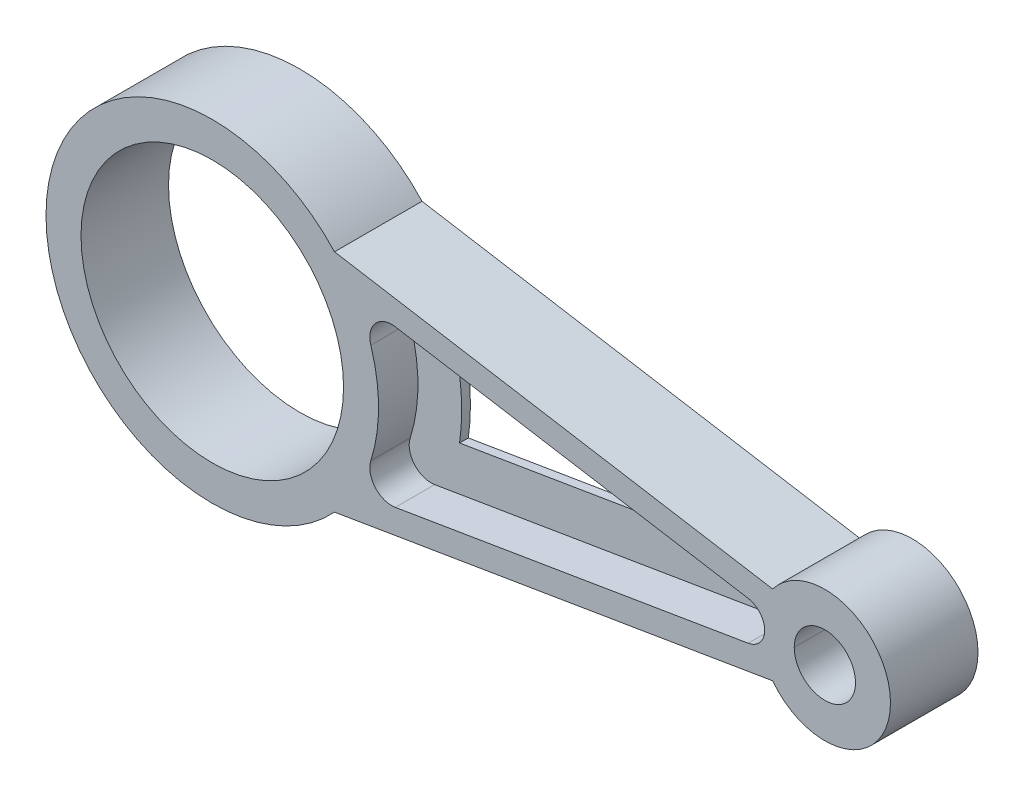
ISO-10303-21;
HEADER;
FILE_DESCRIPTION(('STEP AP214'),'2;1');
FILE_NAME('part.step','',(''),(''),'','','');
FILE_SCHEMA(('AUTOMOTIVE_DESIGN { 1 0 10303 214 1 1 1 1 }'));
ENDSEC;
DATA;
#1=APPLICATION_CONTEXT('core data for automotive mechanical design processes');
#2=APPLICATION_PROTOCOL_DEFINITION('international standard','automotive_design',2000,#1);
#3=PRODUCT_CONTEXT('',#1,'mechanical');
#4=PRODUCT('Part','Part','',(#3));
#5=PRODUCT_RELATED_PRODUCT_CATEGORY('part','',(#4));
#6=PRODUCT_DEFINITION_FORMATION('','',#4);
#7=PRODUCT_DEFINITION_CONTEXT('part definition',#1,'design');
#8=PRODUCT_DEFINITION('design','',#6,#7);
#9=PRODUCT_DEFINITION_SHAPE('','',#8);
#10=(LENGTH_UNIT() NAMED_UNIT(*) SI_UNIT(.MILLI.,.METRE.));
#11=(NAMED_UNIT(*) PLANE_ANGLE_UNIT() SI_UNIT($,.RADIAN.));
#12=(NAMED_UNIT(*) SI_UNIT($,.STERADIAN.) SOLID_ANGLE_UNIT());
#13=UNCERTAINTY_MEASURE_WITH_UNIT(LENGTH_MEASURE(1.E-05),#10,'distance_accuracy_value','');
#14=(GEOMETRIC_REPRESENTATION_CONTEXT(3) GLOBAL_UNCERTAINTY_ASSIGNED_CONTEXT((#13)) GLOBAL_UNIT_ASSIGNED_CONTEXT((#10,
#11,#12)) REPRESENTATION_CONTEXT('',''));
#15=CARTESIAN_POINT('',(0.,0.,0.));
#16=DIRECTION('',(0.,0.,1.));
#17=DIRECTION('',(1.,0.,0.));
#18=AXIS2_PLACEMENT_3D('',#15,#16,#17);
#19=CARTESIAN_POINT('',(41.007125986905,-12.9389187451698,1.));
#20=DIRECTION('',(0.,0.,1.));
#21=DIRECTION('',(1.,0.,0.));
#22=AXIS2_PLACEMENT_3D('',#19,#20,#21);
#23=PLANE('',#22);
#24=CARTESIAN_POINT('',(41.007125986905,-12.9389187451698,1.));
#25=DIRECTION('',(0.,0.,1.));
#26=DIRECTION('',(1.,0.,0.));
#27=AXIS2_PLACEMENT_3D('',#24,#25,#26);
#28=CIRCLE('',#27,5.);
#29=CARTESIAN_POINT('',(36.2388555233114,-11.4343933096849,1.));
#30=VERTEX_POINT('',#29);
#31=CARTESIAN_POINT('',(41.8285545583335,-17.8709827250915,1.));
#32=VERTEX_POINT('',#31);
#33=EDGE_CURVE('E275',#30,#32,#28,.T.);
#34=ORIENTED_EDGE('',*,*,#33,.T.);
#35=DIRECTION('',(0.986412795984335,0.164285714285714,0.));
#36=VECTOR('',#35,1.);
#37=CARTESIAN_POINT('',(122.478416149068,-4.4388575819296,1.));
#38=LINE('',#37,#36);
#39=CARTESIAN_POINT('',(122.478416149068,-4.4388575819296,1.));
#40=VERTEX_POINT('',#39);
#41=EDGE_CURVE('E279',#32,#40,#38,.T.);
#42=ORIENTED_EDGE('',*,*,#41,.T.);
#43=CARTESIAN_POINT('',(121.739130434783,0.,1.));
#44=DIRECTION('',(0.,0.,1.));
#45=DIRECTION('',(-1.,0.,0.));
#46=AXIS2_PLACEMENT_3D('',#43,#44,#45);
#47=CIRCLE('',#46,4.5);
#48=CARTESIAN_POINT('',(122.478416149068,4.4388575819296,1.));
#49=VERTEX_POINT('',#48);
#50=EDGE_CURVE('E284',#40,#49,#47,.T.);
#51=ORIENTED_EDGE('',*,*,#50,.T.);
#52=DIRECTION('',(-0.986412795984335,0.164285714285714,0.));
#53=VECTOR('',#52,1.);
#54=CARTESIAN_POINT('',(41.8285545583335,17.8709827250915,1.));
#55=LINE('',#54,#53);
#56=CARTESIAN_POINT('',(41.8285545583335,17.8709827250915,1.));
#57=VERTEX_POINT('',#56);
#58=EDGE_CURVE('E288',#49,#57,#55,.T.);
#59=ORIENTED_EDGE('',*,*,#58,.T.);
#60=CARTESIAN_POINT('',(41.007125986905,12.9389187451698,1.));
#61=DIRECTION('',(0.,0.,1.));
#62=DIRECTION('',(-1.,0.,0.));
#63=AXIS2_PLACEMENT_3D('',#60,#61,#62);
#64=CIRCLE('',#63,5.);
#65=CARTESIAN_POINT('',(36.2388555233114,11.4343933096849,1.));
#66=VERTEX_POINT('',#65);
#67=EDGE_CURVE('E292',#57,#66,#64,.T.);
#68=ORIENTED_EDGE('',*,*,#67,.T.);
#69=CARTESIAN_POINT('',(0.,0.,1.));
#70=DIRECTION('',(0.,0.,-1.));
#71=DIRECTION('',(1.,0.,0.));
#72=AXIS2_PLACEMENT_3D('',#69,#70,#71);
#73=CIRCLE('',#72,38.);
#74=EDGE_CURVE('E296',#66,#30,#73,.T.);
#75=ORIENTED_EDGE('',*,*,#74,.T.);
#76=EDGE_LOOP('',(#34,#42,#51,#59,#68,#75));
#77=FACE_BOUND('',#76,.T.);
#78=DIRECTION('',(0.986412795984335,0.164285714285714,0.));
#79=VECTOR('',#78,1.);
#80=CARTESIAN_POINT('',(2.38214285714286,-14.3029855417729,1.));
#81=LINE('',#80,#79);
#82=CARTESIAN_POINT('',(47.5179392364682,-6.78567982735087,1.));
#83=VERTEX_POINT('',#82);
#84=CARTESIAN_POINT('',(88.2608695652175,0.,1.));
#85=VERTEX_POINT('',#84);
#86=EDGE_CURVE('E59',#83,#85,#81,.T.);
#87=ORIENTED_EDGE('',*,*,#86,.F.);
#88=CARTESIAN_POINT('',(0.,0.,1.));
#89=DIRECTION('',(0.,0.,1.));
#90=DIRECTION('',(1.,0.,0.));
#91=AXIS2_PLACEMENT_3D('',#88,#89,#90);
#92=CIRCLE('',#91,48.);
#93=CARTESIAN_POINT('',(47.5179392364682,6.78567982735086,1.));
#94=VERTEX_POINT('',#93);
#95=EDGE_CURVE('E193',#83,#94,#92,.T.);
#96=ORIENTED_EDGE('',*,*,#95,.T.);
#97=DIRECTION('',(-0.986412795984335,0.164285714285714,0.));
#98=VECTOR('',#97,1.);
#99=CARTESIAN_POINT('',(2.38214285714286,14.3029855417729,1.));
#100=LINE('',#99,#98);
#101=EDGE_CURVE('E190',#85,#94,#100,.T.);
#102=ORIENTED_EDGE('',*,*,#101,.F.);
#103=EDGE_LOOP('',(#87,#96,#102));
#104=FACE_BOUND('',#103,.T.);
#105=ADVANCED_FACE('F43',(#77,#104),#23,.T.);
#106=CARTESIAN_POINT('',(41.007125986905,-12.9389187451698,-1.));
#107=DIRECTION('',(0.,0.,-1.));
#108=DIRECTION('',(1.,0.,0.));
#109=AXIS2_PLACEMENT_3D('',#106,#107,#108);
#110=PLANE('',#109);
#111=CARTESIAN_POINT('',(41.007125986905,-12.9389187451698,-1.));
#112=DIRECTION('',(0.,0.,1.));
#113=DIRECTION('',(1.,0.,0.));
#114=AXIS2_PLACEMENT_3D('',#111,#112,#113);
#115=CIRCLE('',#114,5.);
#116=CARTESIAN_POINT('',(36.2388555233114,-11.4343933096849,-1.));
#117=VERTEX_POINT('',#116);
#118=CARTESIAN_POINT('',(41.8285545583335,-17.8709827250915,-1.));
#119=VERTEX_POINT('',#118);
#120=EDGE_CURVE('E212',#117,#119,#115,.T.);
#121=ORIENTED_EDGE('',*,*,#120,.F.);
#122=CARTESIAN_POINT('',(0.,0.,-1.));
#123=DIRECTION('',(0.,0.,-1.));
#124=DIRECTION('',(1.,0.,0.));
#125=AXIS2_PLACEMENT_3D('',#122,#123,#124);
#126=CIRCLE('',#125,38.);
#127=CARTESIAN_POINT('',(36.2388555233114,11.4343933096849,-1.));
#128=VERTEX_POINT('',#127);
#129=EDGE_CURVE('E216',#128,#117,#126,.T.);
#130=ORIENTED_EDGE('',*,*,#129,.F.);
#131=CARTESIAN_POINT('',(41.007125986905,12.9389187451698,-1.));
#132=DIRECTION('',(0.,0.,1.));
#133=DIRECTION('',(-1.,0.,0.));
#134=AXIS2_PLACEMENT_3D('',#131,#132,#133);
#135=CIRCLE('',#134,5.);
#136=CARTESIAN_POINT('',(41.8285545583335,17.8709827250915,-1.));
#137=VERTEX_POINT('',#136);
#138=EDGE_CURVE('E220',#137,#128,#135,.T.);
#139=ORIENTED_EDGE('',*,*,#138,.F.);
#140=DIRECTION('',(-0.986412795984335,0.164285714285714,0.));
#141=VECTOR('',#140,1.);
#142=CARTESIAN_POINT('',(41.8285545583335,17.8709827250915,-1.));
#143=LINE('',#142,#141);
#144=CARTESIAN_POINT('',(122.478416149068,4.4388575819296,-1.));
#145=VERTEX_POINT('',#144);
#146=EDGE_CURVE('E223',#145,#137,#143,.T.);
#147=ORIENTED_EDGE('',*,*,#146,.F.);
#148=CARTESIAN_POINT('',(121.739130434783,0.,-1.));
#149=DIRECTION('',(0.,0.,1.));
#150=DIRECTION('',(-1.,0.,0.));
#151=AXIS2_PLACEMENT_3D('',#148,#149,#150);
#152=CIRCLE('',#151,4.5);
#153=CARTESIAN_POINT('',(122.478416149068,-4.4388575819296,-1.));
#154=VERTEX_POINT('',#153);
#155=EDGE_CURVE('E226',#154,#145,#152,.T.);
#156=ORIENTED_EDGE('',*,*,#155,.F.);
#157=DIRECTION('',(0.986412795984335,0.164285714285714,0.));
#158=VECTOR('',#157,1.);
#159=CARTESIAN_POINT('',(122.478416149068,-4.4388575819296,-1.));
#160=LINE('',#159,#158);
#161=EDGE_CURVE('E229',#119,#154,#160,.T.);
#162=ORIENTED_EDGE('',*,*,#161,.F.);
#163=EDGE_LOOP('',(#121,#130,#139,#147,#156,#162));
#164=FACE_BOUND('',#163,.T.);
#165=DIRECTION('',(0.986412795984335,-0.164285714285714,0.));
#166=VECTOR('',#165,1.);
#167=CARTESIAN_POINT('',(44.3792923494486,7.30841721257518,-1.));
#168=LINE('',#167,#166);
#169=CARTESIAN_POINT('',(47.5179392364682,6.78567982735086,-1.));
#170=VERTEX_POINT('',#169);
#171=CARTESIAN_POINT('',(88.2608695652175,0.,-1.));
#172=VERTEX_POINT('',#171);
#173=EDGE_CURVE('E52',#170,#172,#168,.T.);
#174=ORIENTED_EDGE('',*,*,#173,.F.);
#175=CARTESIAN_POINT('',(0.,0.,-1.));
#176=DIRECTION('',(0.,0.,-1.));
#177=DIRECTION('',(-1.,0.,0.));
#178=AXIS2_PLACEMENT_3D('',#175,#176,#177);
#179=CIRCLE('',#178,48.);
#180=CARTESIAN_POINT('',(47.5179392364682,-6.78567982735087,-1.));
#181=VERTEX_POINT('',#180);
#182=EDGE_CURVE('E11',#170,#181,#179,.T.);
#183=ORIENTED_EDGE('',*,*,#182,.T.);
#184=DIRECTION('',(-0.986412795984335,-0.164285714285714,0.));
#185=VECTOR('',#184,1.);
#186=CARTESIAN_POINT('',(40.1856974154764,-8.00685476524813,-1.));
#187=LINE('',#186,#185);
#188=EDGE_CURVE('E187',#172,#181,#187,.T.);
#189=ORIENTED_EDGE('',*,*,#188,.F.);
#190=EDGE_LOOP('',(#174,#183,#189));
#191=FACE_BOUND('',#190,.T.);
#192=ADVANCED_FACE('F413',(#164,#191),#110,.T.);
#193=CARTESIAN_POINT('',(140.,0.,10.));
#194=DIRECTION('',(0.,0.,-1.));
#195=DIRECTION('',(-1.,0.,0.));
#196=AXIS2_PLACEMENT_3D('',#193,#194,#195);
#197=CYLINDRICAL_SURFACE('',#196,7.00000000000001);
#198=CARTESIAN_POINT('',(140.,0.,10.));
#199=DIRECTION('',(0.,0.,1.));
#200=DIRECTION('',(1.,0.,0.));
#201=AXIS2_PLACEMENT_3D('',#198,#199,#200);
#202=CIRCLE('',#201,7.00000000000001);
#203=CARTESIAN_POINT('',(133.,0.,10.));
#204=VERTEX_POINT('',#203);
#205=CARTESIAN_POINT('',(147.,0.,10.));
#206=VERTEX_POINT('',#205);
#207=EDGE_CURVE('E341',#204,#206,#202,.T.);
#208=ORIENTED_EDGE('',*,*,#207,.T.);
#209=DIRECTION('',(0.,0.,-1.));
#210=VECTOR('',#209,1.);
#211=CARTESIAN_POINT('',(147.,0.,10.));
#212=LINE('',#211,#210);
#213=CARTESIAN_POINT('',(147.,0.,-10.));
#214=VERTEX_POINT('',#213);
#215=EDGE_CURVE('E404',#206,#214,#212,.T.);
#216=ORIENTED_EDGE('',*,*,#215,.T.);
#217=CARTESIAN_POINT('',(140.,0.,-10.));
#218=DIRECTION('',(0.,0.,1.));
#219=DIRECTION('',(1.,0.,0.));
#220=AXIS2_PLACEMENT_3D('',#217,#218,#219);
#221=CIRCLE('',#220,7.00000000000001);
#222=CARTESIAN_POINT('',(133.,0.,-10.));
#223=VERTEX_POINT('',#222);
#224=EDGE_CURVE('E347',#223,#214,#221,.T.);
#225=ORIENTED_EDGE('',*,*,#224,.F.);
#226=DIRECTION('',(0.,0.,1.));
#227=VECTOR('',#226,1.);
#228=CARTESIAN_POINT('',(133.,0.,10.));
#229=LINE('',#228,#227);
#230=EDGE_CURVE('E400',#223,#204,#229,.T.);
#231=ORIENTED_EDGE('',*,*,#230,.T.);
#232=EDGE_LOOP('',(#208,#216,#225,#231));
#233=FACE_BOUND('',#232,.T.);
#234=ADVANCED_FACE('F415',(#233),#197,.F.);
#235=CARTESIAN_POINT('',(0.,0.,-10.));
#236=DIRECTION('',(0.,0.,1.));
#237=DIRECTION('',(1.,0.,0.));
#238=AXIS2_PLACEMENT_3D('',#235,#236,#237);
#239=PLANE('',#238);
#240=ORIENTED_EDGE('',*,*,#224,.T.);
#241=EDGE_CURVE('E325',#214,#223,#221,.T.);
#242=ORIENTED_EDGE('',*,*,#241,.T.);
#243=EDGE_LOOP('',(#240,#242));
#244=FACE_BOUND('',#243,.T.);
#245=CARTESIAN_POINT('',(0.,0.,-10.));
#246=DIRECTION('',(0.,0.,1.));
#247=DIRECTION('',(1.,0.,0.));
#248=AXIS2_PLACEMENT_3D('',#245,#246,#247);
#249=CIRCLE('',#248,30.);
#250=CARTESIAN_POINT('',(30.,0.,-10.));
#251=VERTEX_POINT('',#250);
#252=EDGE_CURVE('E345',#251,#251,#249,.T.);
#253=ORIENTED_EDGE('',*,*,#252,.T.);
#254=EDGE_LOOP('',(#253));
#255=FACE_BOUND('',#254,.T.);
#256=CARTESIAN_POINT('',(0.,0.,-10.));
#257=DIRECTION('',(0.,0.,1.));
#258=DIRECTION('',(1.,0.,0.));
#259=AXIS2_PLACEMENT_3D('',#256,#257,#258);
#260=CIRCLE('',#259,38.);
#261=CARTESIAN_POINT('',(27.9354736759495,25.7606154914888,-10.));
#262=VERTEX_POINT('',#261);
#263=CARTESIAN_POINT('',(27.9354736759495,-25.7606154914888,-10.));
#264=VERTEX_POINT('',#263);
#265=EDGE_CURVE('E355',#262,#264,#260,.T.);
#266=ORIENTED_EDGE('',*,*,#265,.F.);
#267=DIRECTION('',(-0.986412795984335,0.164285714285714,0.));
#268=VECTOR('',#267,1.);
#269=CARTESIAN_POINT('',(27.9354736759495,25.7606154914888,-10.));
#270=LINE('',#269,#268);
#271=CARTESIAN_POINT('',(128.063755469258,9.08438586269532,-10.));
#272=VERTEX_POINT('',#271);
#273=EDGE_CURVE('E364',#272,#262,#270,.T.);
#274=ORIENTED_EDGE('',*,*,#273,.F.);
#275=CARTESIAN_POINT('',(140.,0.,-10.));
#276=DIRECTION('',(0.,0.,1.));
#277=DIRECTION('',(1.,0.,0.));
#278=AXIS2_PLACEMENT_3D('',#275,#276,#277);
#279=CIRCLE('',#278,15.);
#280=CARTESIAN_POINT('',(128.063755469258,-9.08438586269532,-10.));
#281=VERTEX_POINT('',#280);
#282=EDGE_CURVE('E380',#281,#272,#279,.T.);
#283=ORIENTED_EDGE('',*,*,#282,.F.);
#284=DIRECTION('',(0.986412795984335,0.164285714285714,0.));
#285=VECTOR('',#284,1.);
#286=CARTESIAN_POINT('',(27.9354736759495,-25.7606154914888,-10.));
#287=LINE('',#286,#285);
#288=EDGE_CURVE('E377',#264,#281,#287,.T.);
#289=ORIENTED_EDGE('',*,*,#288,.F.);
#290=EDGE_LOOP('',(#266,#274,#283,#289));
#291=FACE_BOUND('',#290,.T.);
#292=CARTESIAN_POINT('',(41.007125986905,-12.9389187451698,-10.));
#293=DIRECTION('',(0.,0.,1.));
#294=DIRECTION('',(1.,0.,0.));
#295=AXIS2_PLACEMENT_3D('',#292,#293,#294);
#296=CIRCLE('',#295,5.);
#297=CARTESIAN_POINT('',(36.2388555233114,-11.4343933096849,-10.));
#298=VERTEX_POINT('',#297);
#299=CARTESIAN_POINT('',(41.8285545583335,-17.8709827250915,-10.));
#300=VERTEX_POINT('',#299);
#301=EDGE_CURVE('E209',#298,#300,#296,.T.);
#302=ORIENTED_EDGE('',*,*,#301,.T.);
#303=DIRECTION('',(0.986412795984335,0.164285714285714,0.));
#304=VECTOR('',#303,1.);
#305=CARTESIAN_POINT('',(122.478416149068,-4.4388575819296,-10.));
#306=LINE('',#305,#304);
#307=CARTESIAN_POINT('',(122.478416149068,-4.4388575819296,-10.));
#308=VERTEX_POINT('',#307);
#309=EDGE_CURVE('E217',#300,#308,#306,.T.);
#310=ORIENTED_EDGE('',*,*,#309,.T.);
#311=CARTESIAN_POINT('',(121.739130434783,0.,-10.));
#312=DIRECTION('',(0.,0.,1.));
#313=DIRECTION('',(-1.,0.,0.));
#314=AXIS2_PLACEMENT_3D('',#311,#312,#313);
#315=CIRCLE('',#314,4.5);
#316=CARTESIAN_POINT('',(122.478416149068,4.4388575819296,-10.));
#317=VERTEX_POINT('',#316);
#318=EDGE_CURVE('E248',#308,#317,#315,.T.);
#319=ORIENTED_EDGE('',*,*,#318,.T.);
#320=DIRECTION('',(-0.986412795984335,0.164285714285714,0.));
#321=VECTOR('',#320,1.);
#322=CARTESIAN_POINT('',(41.8285545583335,17.8709827250915,-10.));
#323=LINE('',#322,#321);
#324=CARTESIAN_POINT('',(41.8285545583335,17.8709827250915,-10.));
#325=VERTEX_POINT('',#324);
#326=EDGE_CURVE('E244',#317,#325,#323,.T.);
#327=ORIENTED_EDGE('',*,*,#326,.T.);
#328=CARTESIAN_POINT('',(41.007125986905,12.9389187451698,-10.));
#329=DIRECTION('',(0.,0.,1.));
#330=DIRECTION('',(-1.,0.,0.));
#331=AXIS2_PLACEMENT_3D('',#328,#329,#330);
#332=CIRCLE('',#331,5.);
#333=CARTESIAN_POINT('',(36.2388555233114,11.4343933096849,-10.));
#334=VERTEX_POINT('',#333);
#335=EDGE_CURVE('E240',#325,#334,#332,.T.);
#336=ORIENTED_EDGE('',*,*,#335,.T.);
#337=CARTESIAN_POINT('',(0.,0.,-10.));
#338=DIRECTION('',(0.,0.,-1.));
#339=DIRECTION('',(1.,0.,0.));
#340=AXIS2_PLACEMENT_3D('',#337,#338,#339);
#341=CIRCLE('',#340,38.);
#342=EDGE_CURVE('E236',#334,#298,#341,.T.);
#343=ORIENTED_EDGE('',*,*,#342,.T.);
#344=EDGE_LOOP('',(#302,#310,#319,#327,#336,#343));
#345=FACE_BOUND('',#344,.T.);
#346=ADVANCED_FACE('F422',(#244,#255,#291,#345),#239,.F.);
#347=CARTESIAN_POINT('',(0.,0.,10.));
#348=DIRECTION('',(0.,0.,1.));
#349=DIRECTION('',(1.,0.,0.));
#350=AXIS2_PLACEMENT_3D('',#347,#348,#349);
#351=PLANE('',#350);
#352=CARTESIAN_POINT('',(41.007125986905,-12.9389187451698,10.));
#353=DIRECTION('',(0.,0.,1.));
#354=DIRECTION('',(1.,0.,0.));
#355=AXIS2_PLACEMENT_3D('',#352,#353,#354);
#356=CIRCLE('',#355,5.);
#357=CARTESIAN_POINT('',(36.2388555233114,-11.4343933096849,10.));
#358=VERTEX_POINT('',#357);
#359=CARTESIAN_POINT('',(41.8285545583335,-17.8709827250915,10.));
#360=VERTEX_POINT('',#359);
#361=EDGE_CURVE('E259',#358,#360,#356,.T.);
#362=ORIENTED_EDGE('',*,*,#361,.F.);
#363=CARTESIAN_POINT('',(0.,0.,10.));
#364=DIRECTION('',(0.,0.,-1.));
#365=DIRECTION('',(1.,0.,0.));
#366=AXIS2_PLACEMENT_3D('',#363,#364,#365);
#367=CIRCLE('',#366,38.);
#368=CARTESIAN_POINT('',(36.2388555233114,11.4343933096849,10.));
#369=VERTEX_POINT('',#368);
#370=EDGE_CURVE('E280',#369,#358,#367,.T.);
#371=ORIENTED_EDGE('',*,*,#370,.F.);
#372=CARTESIAN_POINT('',(41.007125986905,12.9389187451698,10.));
#373=DIRECTION('',(0.,0.,1.));
#374=DIRECTION('',(-1.,0.,0.));
#375=AXIS2_PLACEMENT_3D('',#372,#373,#374);
#376=CIRCLE('',#375,5.);
#377=CARTESIAN_POINT('',(41.8285545583335,17.8709827250915,10.));
#378=VERTEX_POINT('',#377);
#379=EDGE_CURVE('E315',#378,#369,#376,.T.);
#380=ORIENTED_EDGE('',*,*,#379,.F.);
#381=DIRECTION('',(-0.986412795984335,0.164285714285714,0.));
#382=VECTOR('',#381,1.);
#383=CARTESIAN_POINT('',(41.8285545583335,17.8709827250915,10.));
#384=LINE('',#383,#382);
#385=CARTESIAN_POINT('',(122.478416149068,4.4388575819296,10.));
#386=VERTEX_POINT('',#385);
#387=EDGE_CURVE('E311',#386,#378,#384,.T.);
#388=ORIENTED_EDGE('',*,*,#387,.F.);
#389=CARTESIAN_POINT('',(121.739130434783,0.,10.));
#390=DIRECTION('',(0.,0.,1.));
#391=DIRECTION('',(-1.,0.,0.));
#392=AXIS2_PLACEMENT_3D('',#389,#390,#391);
#393=CIRCLE('',#392,4.5);
#394=CARTESIAN_POINT('',(122.478416149068,-4.4388575819296,10.));
#395=VERTEX_POINT('',#394);
#396=EDGE_CURVE('E307',#395,#386,#393,.T.);
#397=ORIENTED_EDGE('',*,*,#396,.F.);
#398=DIRECTION('',(0.986412795984335,0.164285714285714,0.));
#399=VECTOR('',#398,1.);
#400=CARTESIAN_POINT('',(122.478416149068,-4.4388575819296,10.));
#401=LINE('',#400,#399);
#402=EDGE_CURVE('E303',#360,#395,#401,.T.);
#403=ORIENTED_EDGE('',*,*,#402,.F.);
#404=EDGE_LOOP('',(#362,#371,#380,#388,#397,#403));
#405=FACE_BOUND('',#404,.T.);
#406=CARTESIAN_POINT('',(0.,0.,10.));
#407=DIRECTION('',(0.,0.,1.));
#408=DIRECTION('',(1.,0.,0.));
#409=AXIS2_PLACEMENT_3D('',#406,#407,#408);
#410=CIRCLE('',#409,30.);
#411=CARTESIAN_POINT('',(30.,0.,10.));
#412=VERTEX_POINT('',#411);
#413=EDGE_CURVE('E351',#412,#412,#410,.T.);
#414=ORIENTED_EDGE('',*,*,#413,.F.);
#415=EDGE_LOOP('',(#414));
#416=FACE_BOUND('',#415,.T.);
#417=CARTESIAN_POINT('',(0.,0.,10.));
#418=DIRECTION('',(0.,0.,1.));
#419=DIRECTION('',(1.,0.,0.));
#420=AXIS2_PLACEMENT_3D('',#417,#418,#419);
#421=CIRCLE('',#420,38.);
#422=CARTESIAN_POINT('',(27.9354736759495,25.7606154914888,10.));
#423=VERTEX_POINT('',#422);
#424=CARTESIAN_POINT('',(27.9354736759495,-25.7606154914888,10.));
#425=VERTEX_POINT('',#424);
#426=EDGE_CURVE('E359',#423,#425,#421,.T.);
#427=ORIENTED_EDGE('',*,*,#426,.T.);
#428=DIRECTION('',(0.986412795984335,0.164285714285714,0.));
#429=VECTOR('',#428,1.);
#430=CARTESIAN_POINT('',(27.9354736759495,-25.7606154914888,10.));
#431=LINE('',#430,#429);
#432=CARTESIAN_POINT('',(128.063755469258,-9.08438586269532,10.));
#433=VERTEX_POINT('',#432);
#434=EDGE_CURVE('E363',#425,#433,#431,.T.);
#435=ORIENTED_EDGE('',*,*,#434,.T.);
#436=CARTESIAN_POINT('',(140.,0.,10.));
#437=DIRECTION('',(0.,0.,1.));
#438=DIRECTION('',(1.,0.,0.));
#439=AXIS2_PLACEMENT_3D('',#436,#437,#438);
#440=CIRCLE('',#439,15.);
#441=CARTESIAN_POINT('',(128.063755469258,9.08438586269532,10.));
#442=VERTEX_POINT('',#441);
#443=EDGE_CURVE('E367',#433,#442,#440,.T.);
#444=ORIENTED_EDGE('',*,*,#443,.T.);
#445=DIRECTION('',(-0.986412795984335,0.164285714285714,0.));
#446=VECTOR('',#445,1.);
#447=CARTESIAN_POINT('',(27.9354736759495,25.7606154914888,10.));
#448=LINE('',#447,#446);
#449=EDGE_CURVE('E370',#442,#423,#448,.T.);
#450=ORIENTED_EDGE('',*,*,#449,.T.);
#451=EDGE_LOOP('',(#427,#435,#444,#450));
#452=FACE_BOUND('',#451,.T.);
#453=ORIENTED_EDGE('',*,*,#207,.F.);
#454=EDGE_CURVE('E346',#206,#204,#202,.T.);
#455=ORIENTED_EDGE('',*,*,#454,.F.);
#456=EDGE_LOOP('',(#453,#455));
#457=FACE_BOUND('',#456,.T.);
#458=ADVANCED_FACE('F487',(#405,#416,#452,#457),#351,.T.);
#459=CARTESIAN_POINT('',(0.,0.,10.));
#460=DIRECTION('',(0.,0.,-1.));
#461=DIRECTION('',(-1.,0.,0.));
#462=AXIS2_PLACEMENT_3D('',#459,#460,#461);
#463=CYLINDRICAL_SURFACE('',#462,38.);
#464=ORIENTED_EDGE('',*,*,#265,.T.);
#465=DIRECTION('',(0.,0.,-1.));
#466=VECTOR('',#465,1.);
#467=CARTESIAN_POINT('',(27.9354736759495,-25.7606154914888,10.));
#468=LINE('',#467,#466);
#469=EDGE_CURVE('E396',#425,#264,#468,.T.);
#470=ORIENTED_EDGE('',*,*,#469,.F.);
#471=ORIENTED_EDGE('',*,*,#426,.F.);
#472=DIRECTION('',(0.,0.,-1.));
#473=VECTOR('',#472,1.);
#474=CARTESIAN_POINT('',(27.9354736759495,25.7606154914888,10.));
#475=LINE('',#474,#473);
#476=EDGE_CURVE('E373',#423,#262,#475,.T.);
#477=ORIENTED_EDGE('',*,*,#476,.T.);
#478=EDGE_LOOP('',(#464,#470,#471,#477));
#479=FACE_BOUND('',#478,.T.);
#480=ADVANCED_FACE('F45',(#479),#463,.T.);
#481=CARTESIAN_POINT('',(27.9354736759495,-25.7606154914888,10.));
#482=DIRECTION('',(-0.164285714285714,0.986412795984335,0.));
#483=DIRECTION('',(-0.986412795984335,-0.164285714285714,0.));
#484=AXIS2_PLACEMENT_3D('',#481,#482,#483);
#485=PLANE('',#484);
#486=ORIENTED_EDGE('',*,*,#288,.T.);
#487=DIRECTION('',(0.,0.,-1.));
#488=VECTOR('',#487,1.);
#489=CARTESIAN_POINT('',(128.063755469258,-9.08438586269532,10.));
#490=LINE('',#489,#488);
#491=EDGE_CURVE('E392',#433,#281,#490,.T.);
#492=ORIENTED_EDGE('',*,*,#491,.F.);
#493=ORIENTED_EDGE('',*,*,#434,.F.);
#494=ORIENTED_EDGE('',*,*,#469,.T.);
#495=EDGE_LOOP('',(#486,#492,#493,#494));
#496=FACE_BOUND('',#495,.T.);
#497=ADVANCED_FACE('F499',(#496),#485,.F.);
#498=CARTESIAN_POINT('',(140.,0.,10.));
#499=DIRECTION('',(0.,0.,-1.));
#500=DIRECTION('',(-1.,0.,0.));
#501=AXIS2_PLACEMENT_3D('',#498,#499,#500);
#502=CYLINDRICAL_SURFACE('',#501,15.);
#503=ORIENTED_EDGE('',*,*,#282,.T.);
#504=DIRECTION('',(0.,0.,-1.));
#505=VECTOR('',#504,1.);
#506=CARTESIAN_POINT('',(128.063755469258,9.08438586269532,10.));
#507=LINE('',#506,#505);
#508=EDGE_CURVE('E388',#442,#272,#507,.T.);
#509=ORIENTED_EDGE('',*,*,#508,.F.);
#510=ORIENTED_EDGE('',*,*,#443,.F.);
#511=ORIENTED_EDGE('',*,*,#491,.T.);
#512=EDGE_LOOP('',(#503,#509,#510,#511));
#513=FACE_BOUND('',#512,.T.);
#514=ADVANCED_FACE('F496',(#513),#502,.T.);
#515=CARTESIAN_POINT('',(27.9354736759495,25.7606154914888,10.));
#516=DIRECTION('',(-0.164285714285714,-0.986412795984335,0.));
#517=DIRECTION('',(0.986412795984335,-0.164285714285714,0.));
#518=AXIS2_PLACEMENT_3D('',#515,#516,#517);
#519=PLANE('',#518);
#520=ORIENTED_EDGE('',*,*,#273,.T.);
#521=ORIENTED_EDGE('',*,*,#476,.F.);
#522=ORIENTED_EDGE('',*,*,#449,.F.);
#523=ORIENTED_EDGE('',*,*,#508,.T.);
#524=EDGE_LOOP('',(#520,#521,#522,#523));
#525=FACE_BOUND('',#524,.T.);
#526=ADVANCED_FACE('F485',(#525),#519,.F.);
#527=CARTESIAN_POINT('',(0.,0.,10.));
#528=DIRECTION('',(0.,0.,-1.));
#529=DIRECTION('',(-1.,0.,0.));
#530=AXIS2_PLACEMENT_3D('',#527,#528,#529);
#531=CYLINDRICAL_SURFACE('',#530,30.);
#532=ORIENTED_EDGE('',*,*,#413,.T.);
#533=EDGE_LOOP('',(#532));
#534=FACE_BOUND('',#533,.T.);
#535=ORIENTED_EDGE('',*,*,#252,.F.);
#536=EDGE_LOOP('',(#535));
#537=FACE_BOUND('',#536,.T.);
#538=ADVANCED_FACE('F481',(#534,#537),#531,.F.);
#539=ORIENTED_EDGE('',*,*,#215,.F.);
#540=ORIENTED_EDGE('',*,*,#454,.T.);
#541=ORIENTED_EDGE('',*,*,#230,.F.);
#542=ORIENTED_EDGE('',*,*,#241,.F.);
#543=EDGE_LOOP('',(#539,#540,#541,#542));
#544=FACE_BOUND('',#543,.T.);
#545=ADVANCED_FACE('F425',(#544),#197,.F.);
#546=CARTESIAN_POINT('',(41.007125986905,-12.9389187451698,1.));
#547=DIRECTION('',(0.,0.,1.));
#548=DIRECTION('',(1.,0.,0.));
#549=AXIS2_PLACEMENT_3D('',#546,#547,#548);
#550=CYLINDRICAL_SURFACE('',#549,5.);
#551=ORIENTED_EDGE('',*,*,#361,.T.);
#552=DIRECTION('',(0.,0.,1.));
#553=VECTOR('',#552,1.);
#554=CARTESIAN_POINT('',(41.8285545583335,-17.8709827250915,1.));
#555=LINE('',#554,#553);
#556=EDGE_CURVE('E300',#32,#360,#555,.T.);
#557=ORIENTED_EDGE('',*,*,#556,.F.);
#558=ORIENTED_EDGE('',*,*,#33,.F.);
#559=DIRECTION('',(0.,0.,1.));
#560=VECTOR('',#559,1.);
#561=CARTESIAN_POINT('',(36.2388555233114,-11.4343933096849,1.));
#562=LINE('',#561,#560);
#563=EDGE_CURVE('E322',#30,#358,#562,.T.);
#564=ORIENTED_EDGE('',*,*,#563,.T.);
#565=EDGE_LOOP('',(#551,#557,#558,#564));
#566=FACE_BOUND('',#565,.T.);
#567=ADVANCED_FACE('F461',(#566),#550,.F.);
#568=CARTESIAN_POINT('',(0.,0.,1.));
#569=DIRECTION('',(0.,0.,1.));
#570=DIRECTION('',(1.,0.,0.));
#571=AXIS2_PLACEMENT_3D('',#568,#569,#570);
#572=CYLINDRICAL_SURFACE('',#571,38.);
#573=ORIENTED_EDGE('',*,*,#370,.T.);
#574=ORIENTED_EDGE('',*,*,#563,.F.);
#575=ORIENTED_EDGE('',*,*,#74,.F.);
#576=DIRECTION('',(0.,0.,1.));
#577=VECTOR('',#576,1.);
#578=CARTESIAN_POINT('',(36.2388555233114,11.4343933096849,1.));
#579=LINE('',#578,#577);
#580=EDGE_CURVE('E326',#66,#369,#579,.T.);
#581=ORIENTED_EDGE('',*,*,#580,.T.);
#582=EDGE_LOOP('',(#573,#574,#575,#581));
#583=FACE_BOUND('',#582,.T.);
#584=ADVANCED_FACE('F457',(#583),#572,.T.);
#585=CARTESIAN_POINT('',(41.007125986905,12.9389187451698,1.));
#586=DIRECTION('',(0.,0.,1.));
#587=DIRECTION('',(1.,0.,0.));
#588=AXIS2_PLACEMENT_3D('',#585,#586,#587);
#589=CYLINDRICAL_SURFACE('',#588,5.);
#590=ORIENTED_EDGE('',*,*,#379,.T.);
#591=ORIENTED_EDGE('',*,*,#580,.F.);
#592=ORIENTED_EDGE('',*,*,#67,.F.);
#593=DIRECTION('',(0.,0.,1.));
#594=VECTOR('',#593,1.);
#595=CARTESIAN_POINT('',(41.8285545583335,17.8709827250915,1.));
#596=LINE('',#595,#594);
#597=EDGE_CURVE('E329',#57,#378,#596,.T.);
#598=ORIENTED_EDGE('',*,*,#597,.T.);
#599=EDGE_LOOP('',(#590,#591,#592,#598));
#600=FACE_BOUND('',#599,.T.);
#601=ADVANCED_FACE('F460',(#600),#589,.F.);
#602=CARTESIAN_POINT('',(41.8285545583335,17.8709827250915,1.));
#603=DIRECTION('',(0.164285714285714,0.986412795984335,0.));
#604=DIRECTION('',(-0.986412795984335,0.164285714285714,0.));
#605=AXIS2_PLACEMENT_3D('',#602,#603,#604);
#606=PLANE('',#605);
#607=ORIENTED_EDGE('',*,*,#387,.T.);
#608=ORIENTED_EDGE('',*,*,#597,.F.);
#609=ORIENTED_EDGE('',*,*,#58,.F.);
#610=DIRECTION('',(0.,0.,1.));
#611=VECTOR('',#610,1.);
#612=CARTESIAN_POINT('',(122.478416149068,4.4388575819296,1.));
#613=LINE('',#612,#611);
#614=EDGE_CURVE('E332',#49,#386,#613,.T.);
#615=ORIENTED_EDGE('',*,*,#614,.T.);
#616=EDGE_LOOP('',(#607,#608,#609,#615));
#617=FACE_BOUND('',#616,.T.);
#618=ADVANCED_FACE('F465',(#617),#606,.F.);
#619=CARTESIAN_POINT('',(121.739130434783,0.,1.));
#620=DIRECTION('',(0.,0.,1.));
#621=DIRECTION('',(1.,0.,0.));
#622=AXIS2_PLACEMENT_3D('',#619,#620,#621);
#623=CYLINDRICAL_SURFACE('',#622,4.5);
#624=ORIENTED_EDGE('',*,*,#396,.T.);
#625=ORIENTED_EDGE('',*,*,#614,.F.);
#626=ORIENTED_EDGE('',*,*,#50,.F.);
#627=DIRECTION('',(0.,0.,1.));
#628=VECTOR('',#627,1.);
#629=CARTESIAN_POINT('',(122.478416149068,-4.4388575819296,1.));
#630=LINE('',#629,#628);
#631=EDGE_CURVE('E335',#40,#395,#630,.T.);
#632=ORIENTED_EDGE('',*,*,#631,.T.);
#633=EDGE_LOOP('',(#624,#625,#626,#632));
#634=FACE_BOUND('',#633,.T.);
#635=ADVANCED_FACE('F469',(#634),#623,.F.);
#636=CARTESIAN_POINT('',(122.478416149068,-4.4388575819296,1.));
#637=DIRECTION('',(0.164285714285714,-0.986412795984335,0.));
#638=DIRECTION('',(0.986412795984335,0.164285714285714,0.));
#639=AXIS2_PLACEMENT_3D('',#636,#637,#638);
#640=PLANE('',#639);
#641=ORIENTED_EDGE('',*,*,#402,.T.);
#642=ORIENTED_EDGE('',*,*,#631,.F.);
#643=ORIENTED_EDGE('',*,*,#41,.F.);
#644=ORIENTED_EDGE('',*,*,#556,.T.);
#645=EDGE_LOOP('',(#641,#642,#643,#644));
#646=FACE_BOUND('',#645,.T.);
#647=ADVANCED_FACE('F454',(#646),#640,.F.);
#648=CARTESIAN_POINT('',(41.007125986905,-12.9389187451698,-1.));
#649=DIRECTION('',(0.,0.,-1.));
#650=DIRECTION('',(-1.,0.,0.));
#651=AXIS2_PLACEMENT_3D('',#648,#649,#650);
#652=CYLINDRICAL_SURFACE('',#651,5.);
#653=ORIENTED_EDGE('',*,*,#301,.F.);
#654=DIRECTION('',(0.,0.,-1.));
#655=VECTOR('',#654,1.);
#656=CARTESIAN_POINT('',(36.2388555233114,-11.4343933096849,-1.));
#657=LINE('',#656,#655);
#658=EDGE_CURVE('E232',#117,#298,#657,.T.);
#659=ORIENTED_EDGE('',*,*,#658,.F.);
#660=ORIENTED_EDGE('',*,*,#120,.T.);
#661=DIRECTION('',(0.,0.,-1.));
#662=VECTOR('',#661,1.);
#663=CARTESIAN_POINT('',(41.8285545583335,-17.8709827250915,-1.));
#664=LINE('',#663,#662);
#665=EDGE_CURVE('E255',#119,#300,#664,.T.);
#666=ORIENTED_EDGE('',*,*,#665,.T.);
#667=EDGE_LOOP('',(#653,#659,#660,#666));
#668=FACE_BOUND('',#667,.T.);
#669=ADVANCED_FACE('F436',(#668),#652,.F.);
#670=CARTESIAN_POINT('',(122.478416149068,-4.4388575819296,-1.));
#671=DIRECTION('',(-0.164285714285714,0.986412795984335,0.));
#672=DIRECTION('',(-0.986412795984335,-0.164285714285714,0.));
#673=AXIS2_PLACEMENT_3D('',#670,#671,#672);
#674=PLANE('',#673);
#675=ORIENTED_EDGE('',*,*,#309,.F.);
#676=ORIENTED_EDGE('',*,*,#665,.F.);
#677=ORIENTED_EDGE('',*,*,#161,.T.);
#678=DIRECTION('',(0.,0.,-1.));
#679=VECTOR('',#678,1.);
#680=CARTESIAN_POINT('',(122.478416149068,-4.4388575819296,-1.));
#681=LINE('',#680,#679);
#682=EDGE_CURVE('E260',#154,#308,#681,.T.);
#683=ORIENTED_EDGE('',*,*,#682,.T.);
#684=EDGE_LOOP('',(#675,#676,#677,#683));
#685=FACE_BOUND('',#684,.T.);
#686=ADVANCED_FACE('F432',(#685),#674,.T.);
#687=CARTESIAN_POINT('',(121.739130434783,0.,-1.));
#688=DIRECTION('',(0.,0.,-1.));
#689=DIRECTION('',(-1.,0.,0.));
#690=AXIS2_PLACEMENT_3D('',#687,#688,#689);
#691=CYLINDRICAL_SURFACE('',#690,4.5);
#692=ORIENTED_EDGE('',*,*,#318,.F.);
#693=ORIENTED_EDGE('',*,*,#682,.F.);
#694=ORIENTED_EDGE('',*,*,#155,.T.);
#695=DIRECTION('',(0.,0.,-1.));
#696=VECTOR('',#695,1.);
#697=CARTESIAN_POINT('',(122.478416149068,4.4388575819296,-1.));
#698=LINE('',#697,#696);
#699=EDGE_CURVE('E263',#145,#317,#698,.T.);
#700=ORIENTED_EDGE('',*,*,#699,.T.);
#701=EDGE_LOOP('',(#692,#693,#694,#700));
#702=FACE_BOUND('',#701,.T.);
#703=ADVANCED_FACE('F435',(#702),#691,.F.);
#704=CARTESIAN_POINT('',(41.8285545583335,17.8709827250915,-1.));
#705=DIRECTION('',(-0.164285714285714,-0.986412795984335,0.));
#706=DIRECTION('',(0.986412795984335,-0.164285714285714,0.));
#707=AXIS2_PLACEMENT_3D('',#704,#705,#706);
#708=PLANE('',#707);
#709=ORIENTED_EDGE('',*,*,#326,.F.);
#710=ORIENTED_EDGE('',*,*,#699,.F.);
#711=ORIENTED_EDGE('',*,*,#146,.T.);
#712=DIRECTION('',(0.,0.,-1.));
#713=VECTOR('',#712,1.);
#714=CARTESIAN_POINT('',(41.8285545583335,17.8709827250915,-1.));
#715=LINE('',#714,#713);
#716=EDGE_CURVE('E266',#137,#325,#715,.T.);
#717=ORIENTED_EDGE('',*,*,#716,.T.);
#718=EDGE_LOOP('',(#709,#710,#711,#717));
#719=FACE_BOUND('',#718,.T.);
#720=ADVANCED_FACE('F440',(#719),#708,.T.);
#721=CARTESIAN_POINT('',(41.007125986905,12.9389187451698,-1.));
#722=DIRECTION('',(0.,0.,-1.));
#723=DIRECTION('',(-1.,0.,0.));
#724=AXIS2_PLACEMENT_3D('',#721,#722,#723);
#725=CYLINDRICAL_SURFACE('',#724,5.);
#726=ORIENTED_EDGE('',*,*,#335,.F.);
#727=ORIENTED_EDGE('',*,*,#716,.F.);
#728=ORIENTED_EDGE('',*,*,#138,.T.);
#729=DIRECTION('',(0.,0.,-1.));
#730=VECTOR('',#729,1.);
#731=CARTESIAN_POINT('',(36.2388555233114,11.4343933096849,-1.));
#732=LINE('',#731,#730);
#733=EDGE_CURVE('E269',#128,#334,#732,.T.);
#734=ORIENTED_EDGE('',*,*,#733,.T.);
#735=EDGE_LOOP('',(#726,#727,#728,#734));
#736=FACE_BOUND('',#735,.T.);
#737=ADVANCED_FACE('F444',(#736),#725,.F.);
#738=CARTESIAN_POINT('',(0.,0.,-1.));
#739=DIRECTION('',(0.,0.,-1.));
#740=DIRECTION('',(-1.,0.,0.));
#741=AXIS2_PLACEMENT_3D('',#738,#739,#740);
#742=CYLINDRICAL_SURFACE('',#741,38.);
#743=ORIENTED_EDGE('',*,*,#342,.F.);
#744=ORIENTED_EDGE('',*,*,#733,.F.);
#745=ORIENTED_EDGE('',*,*,#129,.T.);
#746=ORIENTED_EDGE('',*,*,#658,.T.);
#747=EDGE_LOOP('',(#743,#744,#745,#746));
#748=FACE_BOUND('',#747,.T.);
#749=ADVANCED_FACE('F448',(#748),#742,.T.);
#750=CARTESIAN_POINT('',(0.,0.,-10.));
#751=DIRECTION('',(0.,0.,1.));
#752=DIRECTION('',(1.,0.,0.));
#753=AXIS2_PLACEMENT_3D('',#750,#751,#752);
#754=CYLINDRICAL_SURFACE('',#753,48.);
#755=DIRECTION('',(0.,0.,1.));
#756=VECTOR('',#755,1.);
#757=CARTESIAN_POINT('',(47.5179392364682,6.78567982735086,-10.));
#758=LINE('',#757,#756);
#759=EDGE_CURVE('E196',#170,#94,#758,.T.);
#760=ORIENTED_EDGE('',*,*,#759,.T.);
#761=ORIENTED_EDGE('',*,*,#95,.F.);
#762=DIRECTION('',(0.,0.,1.));
#763=VECTOR('',#762,1.);
#764=CARTESIAN_POINT('',(47.5179392364682,-6.78567982735087,-10.));
#765=LINE('',#764,#763);
#766=EDGE_CURVE('E183',#181,#83,#765,.T.);
#767=ORIENTED_EDGE('',*,*,#766,.F.);
#768=ORIENTED_EDGE('',*,*,#182,.F.);
#769=EDGE_LOOP('',(#760,#761,#767,#768));
#770=FACE_BOUND('',#769,.T.);
#771=ADVANCED_FACE('F194',(#770),#754,.T.);
#772=CARTESIAN_POINT('',(2.38214285714286,14.3029855417729,-10.));
#773=DIRECTION('',(0.164285714285714,0.986412795984335,0.));
#774=DIRECTION('',(-0.986412795984335,0.164285714285714,0.));
#775=AXIS2_PLACEMENT_3D('',#772,#773,#774);
#776=PLANE('',#775);
#777=ORIENTED_EDGE('',*,*,#173,.T.);
#778=DIRECTION('',(0.,0.,1.));
#779=VECTOR('',#778,1.);
#780=CARTESIAN_POINT('',(88.2608695652175,0.,-10.));
#781=LINE('',#780,#779);
#782=EDGE_CURVE('E63',#172,#85,#781,.T.);
#783=ORIENTED_EDGE('',*,*,#782,.T.);
#784=ORIENTED_EDGE('',*,*,#101,.T.);
#785=ORIENTED_EDGE('',*,*,#759,.F.);
#786=EDGE_LOOP('',(#777,#783,#784,#785));
#787=FACE_BOUND('',#786,.T.);
#788=ADVANCED_FACE('F411',(#787),#776,.F.);
#789=CARTESIAN_POINT('',(2.38214285714286,-14.3029855417729,-10.));
#790=DIRECTION('',(0.164285714285714,-0.986412795984335,0.));
#791=DIRECTION('',(0.986412795984335,0.164285714285714,0.));
#792=AXIS2_PLACEMENT_3D('',#789,#790,#791);
#793=PLANE('',#792);
#794=ORIENTED_EDGE('',*,*,#188,.T.);
#795=ORIENTED_EDGE('',*,*,#766,.T.);
#796=ORIENTED_EDGE('',*,*,#86,.T.);
#797=ORIENTED_EDGE('',*,*,#782,.F.);
#798=EDGE_LOOP('',(#794,#795,#796,#797));
#799=FACE_BOUND('',#798,.T.);
#800=ADVANCED_FACE('F185',(#799),#793,.F.);
#801=CLOSED_SHELL('',(#105,#192,#234,#346,#458,#480,#497,#514,#526,#538,#545,#567,#584,#601,
#618,#635,#647,#669,#686,#703,#720,#737,#749,#771,#788,#800));
#802=MANIFOLD_SOLID_BREP('B2',#801);
#803=ADVANCED_BREP_SHAPE_REPRESENTATION('',(#18,#802),#14);
#804=SHAPE_DEFINITION_REPRESENTATION(#9,#803);
ENDSEC;
END-ISO-10303-21;
